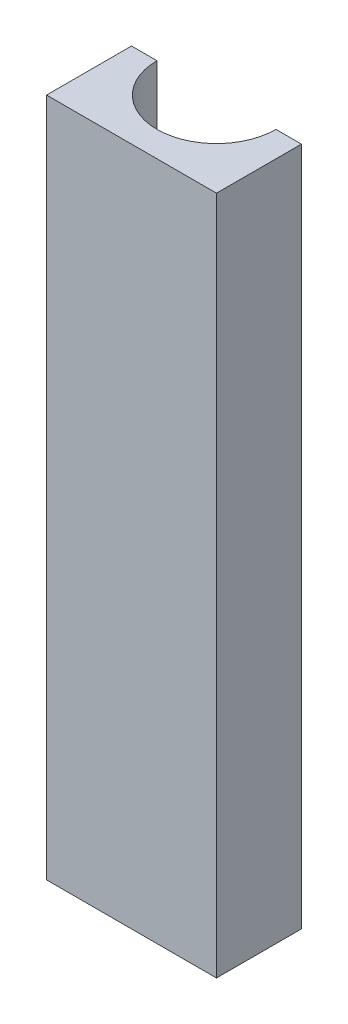
ISO-10303-21;
HEADER;
FILE_DESCRIPTION(('STEP AP214'),'2;1');
FILE_NAME('part.step','',(''),(''),'','','');
FILE_SCHEMA(('AUTOMOTIVE_DESIGN { 1 0 10303 214 1 1 1 1 }'));
ENDSEC;
DATA;
#1=APPLICATION_CONTEXT('core data for automotive mechanical design processes');
#2=APPLICATION_PROTOCOL_DEFINITION('international standard','automotive_design',2000,#1);
#3=PRODUCT_CONTEXT('',#1,'mechanical');
#4=PRODUCT('Part','Part','',(#3));
#5=PRODUCT_RELATED_PRODUCT_CATEGORY('part','',(#4));
#6=PRODUCT_DEFINITION_FORMATION('','',#4);
#7=PRODUCT_DEFINITION_CONTEXT('part definition',#1,'design');
#8=PRODUCT_DEFINITION('design','',#6,#7);
#9=PRODUCT_DEFINITION_SHAPE('','',#8);
#10=(LENGTH_UNIT() NAMED_UNIT(*) SI_UNIT(.MILLI.,.METRE.));
#11=(NAMED_UNIT(*) PLANE_ANGLE_UNIT() SI_UNIT($,.RADIAN.));
#12=(NAMED_UNIT(*) SI_UNIT($,.STERADIAN.) SOLID_ANGLE_UNIT());
#13=UNCERTAINTY_MEASURE_WITH_UNIT(LENGTH_MEASURE(1.E-05),#10,'distance_accuracy_value','');
#14=(GEOMETRIC_REPRESENTATION_CONTEXT(3) GLOBAL_UNCERTAINTY_ASSIGNED_CONTEXT((#13)) GLOBAL_UNIT_ASSIGNED_CONTEXT((#10,
#11,#12)) REPRESENTATION_CONTEXT('',''));
#15=CARTESIAN_POINT('',(0.,0.,0.));
#16=DIRECTION('',(0.,0.,1.));
#17=DIRECTION('',(1.,0.,0.));
#18=AXIS2_PLACEMENT_3D('',#15,#16,#17);
#19=CARTESIAN_POINT('',(0.,80.,-10.));
#20=DIRECTION('',(0.,0.,1.));
#21=DIRECTION('',(1.,0.,0.));
#22=AXIS2_PLACEMENT_3D('',#19,#20,#21);
#23=PLANE('',#22);
#24=DIRECTION('',(-1.,0.,0.));
#25=VECTOR('',#24,1.);
#26=CARTESIAN_POINT('',(0.,0.,-10.));
#27=LINE('',#26,#25);
#28=CARTESIAN_POINT('',(20.,0.,-10.));
#29=VERTEX_POINT('',#28);
#30=CARTESIAN_POINT('',(17.,0.,-10.));
#31=VERTEX_POINT('',#30);
#32=EDGE_CURVE('E105',#29,#31,#27,.T.);
#33=ORIENTED_EDGE('',*,*,#32,.T.);
#34=DIRECTION('',(0.,1.,0.));
#35=VECTOR('',#34,1.);
#36=CARTESIAN_POINT('',(17.,0.,-10.));
#37=LINE('',#36,#35);
#38=CARTESIAN_POINT('',(17.,80.,-10.));
#39=VERTEX_POINT('',#38);
#40=EDGE_CURVE('E47',#31,#39,#37,.T.);
#41=ORIENTED_EDGE('',*,*,#40,.T.);
#42=DIRECTION('',(-1.,0.,0.));
#43=VECTOR('',#42,1.);
#44=CARTESIAN_POINT('',(0.,80.,-10.));
#45=LINE('',#44,#43);
#46=CARTESIAN_POINT('',(20.,80.,-10.));
#47=VERTEX_POINT('',#46);
#48=EDGE_CURVE('E116',#47,#39,#45,.T.);
#49=ORIENTED_EDGE('',*,*,#48,.F.);
#50=DIRECTION('',(0.,-1.,0.));
#51=VECTOR('',#50,1.);
#52=CARTESIAN_POINT('',(20.,80.,-10.));
#53=LINE('',#52,#51);
#54=EDGE_CURVE('E115',#47,#29,#53,.T.);
#55=ORIENTED_EDGE('',*,*,#54,.T.);
#56=EDGE_LOOP('',(#33,#41,#49,#55));
#57=FACE_BOUND('',#56,.T.);
#58=ADVANCED_FACE('F33',(#57),#23,.F.);
#59=CARTESIAN_POINT('',(0.,80.,0.));
#60=DIRECTION('',(1.,0.,0.));
#61=DIRECTION('',(0.,0.,-1.));
#62=AXIS2_PLACEMENT_3D('',#59,#60,#61);
#63=PLANE('',#62);
#64=DIRECTION('',(0.,0.,1.));
#65=VECTOR('',#64,1.);
#66=CARTESIAN_POINT('',(0.,0.,0.));
#67=LINE('',#66,#65);
#68=CARTESIAN_POINT('',(0.,0.,-10.));
#69=VERTEX_POINT('',#68);
#70=CARTESIAN_POINT('',(0.,0.,0.));
#71=VERTEX_POINT('',#70);
#72=EDGE_CURVE('E104',#69,#71,#67,.T.);
#73=ORIENTED_EDGE('',*,*,#72,.T.);
#74=DIRECTION('',(0.,-1.,0.));
#75=VECTOR('',#74,1.);
#76=CARTESIAN_POINT('',(0.,80.,0.));
#77=LINE('',#76,#75);
#78=CARTESIAN_POINT('',(0.,80.,0.));
#79=VERTEX_POINT('',#78);
#80=EDGE_CURVE('E41',#79,#71,#77,.T.);
#81=ORIENTED_EDGE('',*,*,#80,.F.);
#82=DIRECTION('',(0.,0.,1.));
#83=VECTOR('',#82,1.);
#84=CARTESIAN_POINT('',(0.,80.,0.));
#85=LINE('',#84,#83);
#86=CARTESIAN_POINT('',(0.,80.,-10.));
#87=VERTEX_POINT('',#86);
#88=EDGE_CURVE('E108',#87,#79,#85,.T.);
#89=ORIENTED_EDGE('',*,*,#88,.F.);
#90=DIRECTION('',(0.,-1.,0.));
#91=VECTOR('',#90,1.);
#92=CARTESIAN_POINT('',(0.,80.,-10.));
#93=LINE('',#92,#91);
#94=EDGE_CURVE('E113',#87,#69,#93,.T.);
#95=ORIENTED_EDGE('',*,*,#94,.T.);
#96=EDGE_LOOP('',(#73,#81,#89,#95));
#97=FACE_BOUND('',#96,.T.);
#98=ADVANCED_FACE('F35',(#97),#63,.F.);
#99=CARTESIAN_POINT('',(0.,80.,0.));
#100=DIRECTION('',(0.,0.,-1.));
#101=DIRECTION('',(-1.,0.,0.));
#102=AXIS2_PLACEMENT_3D('',#99,#100,#101);
#103=PLANE('',#102);
#104=DIRECTION('',(1.,0.,0.));
#105=VECTOR('',#104,1.);
#106=CARTESIAN_POINT('',(0.,0.,0.));
#107=LINE('',#106,#105);
#108=CARTESIAN_POINT('',(20.,0.,0.));
#109=VERTEX_POINT('',#108);
#110=EDGE_CURVE('E109',#71,#109,#107,.T.);
#111=ORIENTED_EDGE('',*,*,#110,.T.);
#112=DIRECTION('',(0.,-1.,0.));
#113=VECTOR('',#112,1.);
#114=CARTESIAN_POINT('',(20.,80.,0.));
#115=LINE('',#114,#113);
#116=CARTESIAN_POINT('',(20.,80.,0.));
#117=VERTEX_POINT('',#116);
#118=EDGE_CURVE('E119',#117,#109,#115,.T.);
#119=ORIENTED_EDGE('',*,*,#118,.F.);
#120=DIRECTION('',(1.,0.,0.));
#121=VECTOR('',#120,1.);
#122=CARTESIAN_POINT('',(0.,80.,0.));
#123=LINE('',#122,#121);
#124=EDGE_CURVE('E86',#79,#117,#123,.T.);
#125=ORIENTED_EDGE('',*,*,#124,.F.);
#126=ORIENTED_EDGE('',*,*,#80,.T.);
#127=EDGE_LOOP('',(#111,#119,#125,#126));
#128=FACE_BOUND('',#127,.T.);
#129=ADVANCED_FACE('F122',(#128),#103,.F.);
#130=CARTESIAN_POINT('',(20.,80.,0.));
#131=DIRECTION('',(-1.,0.,0.));
#132=DIRECTION('',(0.,0.,1.));
#133=AXIS2_PLACEMENT_3D('',#130,#131,#132);
#134=PLANE('',#133);
#135=DIRECTION('',(0.,0.,-1.));
#136=VECTOR('',#135,1.);
#137=CARTESIAN_POINT('',(20.,0.,0.));
#138=LINE('',#137,#136);
#139=EDGE_CURVE('E106',#109,#29,#138,.T.);
#140=ORIENTED_EDGE('',*,*,#139,.T.);
#141=ORIENTED_EDGE('',*,*,#54,.F.);
#142=DIRECTION('',(0.,0.,-1.));
#143=VECTOR('',#142,1.);
#144=CARTESIAN_POINT('',(20.,80.,0.));
#145=LINE('',#144,#143);
#146=EDGE_CURVE('E130',#117,#47,#145,.T.);
#147=ORIENTED_EDGE('',*,*,#146,.F.);
#148=ORIENTED_EDGE('',*,*,#118,.T.);
#149=EDGE_LOOP('',(#140,#141,#147,#148));
#150=FACE_BOUND('',#149,.T.);
#151=ADVANCED_FACE('F140',(#150),#134,.F.);
#152=CARTESIAN_POINT('',(3.,80.,-10.));
#153=VERTEX_POINT('',#152);
#154=EDGE_CURVE('E56',#153,#87,#45,.T.);
#155=ORIENTED_EDGE('',*,*,#154,.F.);
#156=DIRECTION('',(0.,1.,0.));
#157=VECTOR('',#156,1.);
#158=CARTESIAN_POINT('',(3.,0.,-10.));
#159=LINE('',#158,#157);
#160=CARTESIAN_POINT('',(3.,0.,-10.));
#161=VERTEX_POINT('',#160);
#162=EDGE_CURVE('E94',#153,#161,#159,.F.);
#163=ORIENTED_EDGE('',*,*,#162,.T.);
#164=EDGE_CURVE('E78',#161,#69,#27,.T.);
#165=ORIENTED_EDGE('',*,*,#164,.T.);
#166=ORIENTED_EDGE('',*,*,#94,.F.);
#167=EDGE_LOOP('',(#155,#163,#165,#166));
#168=FACE_BOUND('',#167,.T.);
#169=ADVANCED_FACE('F98',(#168),#23,.F.);
#170=CARTESIAN_POINT('',(0.,80.,0.));
#171=DIRECTION('',(0.,-1.,0.));
#172=DIRECTION('',(0.,0.,-1.));
#173=AXIS2_PLACEMENT_3D('',#170,#171,#172);
#174=PLANE('',#173);
#175=ORIENTED_EDGE('',*,*,#48,.T.);
#176=CARTESIAN_POINT('',(10.,80.,-10.));
#177=DIRECTION('',(0.,1.,0.));
#178=DIRECTION('',(0.,0.,1.));
#179=AXIS2_PLACEMENT_3D('',#176,#177,#178);
#180=CIRCLE('',#179,7.);
#181=EDGE_CURVE('E99',#153,#39,#180,.T.);
#182=ORIENTED_EDGE('',*,*,#181,.F.);
#183=ORIENTED_EDGE('',*,*,#154,.T.);
#184=ORIENTED_EDGE('',*,*,#88,.T.);
#185=ORIENTED_EDGE('',*,*,#124,.T.);
#186=ORIENTED_EDGE('',*,*,#146,.T.);
#187=EDGE_LOOP('',(#175,#182,#183,#184,#185,#186));
#188=FACE_BOUND('',#187,.T.);
#189=ADVANCED_FACE('F136',(#188),#174,.F.);
#190=CARTESIAN_POINT('',(0.,0.,0.));
#191=DIRECTION('',(0.,-1.,0.));
#192=DIRECTION('',(0.,0.,-1.));
#193=AXIS2_PLACEMENT_3D('',#190,#191,#192);
#194=PLANE('',#193);
#195=CARTESIAN_POINT('',(10.,0.,-10.));
#196=DIRECTION('',(0.,-1.,0.));
#197=DIRECTION('',(0.,0.,-1.));
#198=AXIS2_PLACEMENT_3D('',#195,#196,#197);
#199=CIRCLE('',#198,7.);
#200=EDGE_CURVE('E11',#31,#161,#199,.T.);
#201=ORIENTED_EDGE('',*,*,#200,.F.);
#202=ORIENTED_EDGE('',*,*,#32,.F.);
#203=ORIENTED_EDGE('',*,*,#139,.F.);
#204=ORIENTED_EDGE('',*,*,#110,.F.);
#205=ORIENTED_EDGE('',*,*,#72,.F.);
#206=ORIENTED_EDGE('',*,*,#164,.F.);
#207=EDGE_LOOP('',(#201,#202,#203,#204,#205,#206));
#208=FACE_BOUND('',#207,.T.);
#209=ADVANCED_FACE('F102',(#208),#194,.T.);
#210=CARTESIAN_POINT('',(10.,0.,-10.));
#211=DIRECTION('',(0.,1.,0.));
#212=DIRECTION('',(0.,0.,1.));
#213=AXIS2_PLACEMENT_3D('',#210,#211,#212);
#214=CYLINDRICAL_SURFACE('',#213,7.);
#215=ORIENTED_EDGE('',*,*,#200,.T.);
#216=ORIENTED_EDGE('',*,*,#162,.F.);
#217=ORIENTED_EDGE('',*,*,#181,.T.);
#218=ORIENTED_EDGE('',*,*,#40,.F.);
#219=EDGE_LOOP('',(#215,#216,#217,#218));
#220=FACE_BOUND('',#219,.T.);
#221=ADVANCED_FACE('F93',(#220),#214,.F.);
#222=CLOSED_SHELL('',(#58,#98,#129,#151,#169,#189,#209,#221));
#223=MANIFOLD_SOLID_BREP('B2',#222);
#224=ADVANCED_BREP_SHAPE_REPRESENTATION('',(#18,#223),#14);
#225=SHAPE_DEFINITION_REPRESENTATION(#9,#224);
ENDSEC;
END-ISO-10303-21;
